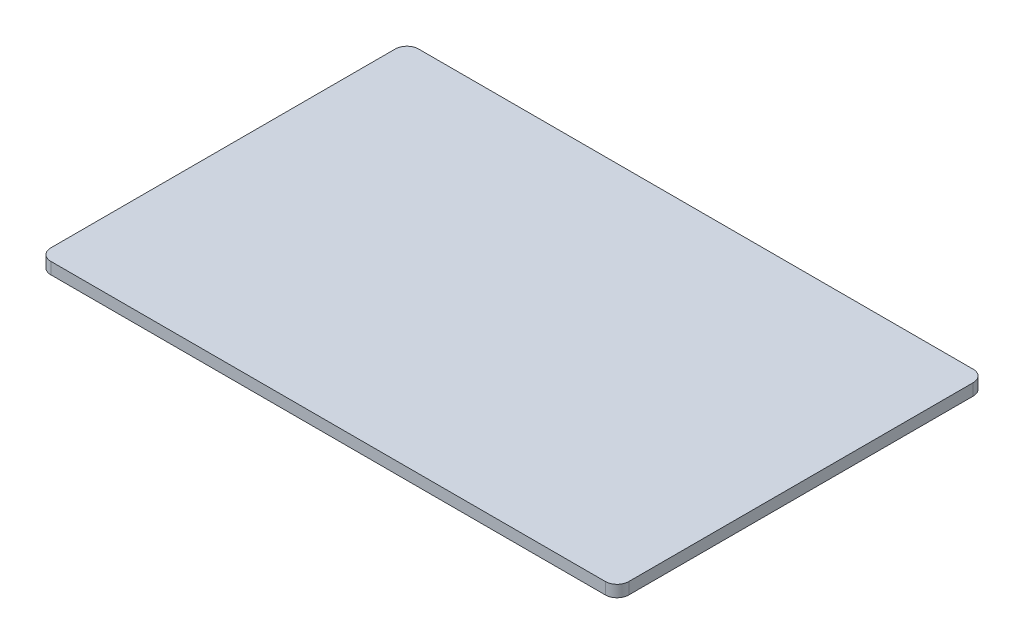
ISO-10303-21;
HEADER;
FILE_DESCRIPTION(('STEP AP214'),'2;1');
FILE_NAME('part.step','',(''),(''),'','','');
FILE_SCHEMA(('AUTOMOTIVE_DESIGN { 1 0 10303 214 1 1 1 1 }'));
ENDSEC;
DATA;
#1=APPLICATION_CONTEXT('core data for automotive mechanical design processes');
#2=APPLICATION_PROTOCOL_DEFINITION('international standard','automotive_design',2000,#1);
#3=PRODUCT_CONTEXT('',#1,'mechanical');
#4=PRODUCT('Part','Part','',(#3));
#5=PRODUCT_RELATED_PRODUCT_CATEGORY('part','',(#4));
#6=PRODUCT_DEFINITION_FORMATION('','',#4);
#7=PRODUCT_DEFINITION_CONTEXT('part definition',#1,'design');
#8=PRODUCT_DEFINITION('design','',#6,#7);
#9=PRODUCT_DEFINITION_SHAPE('','',#8);
#10=(LENGTH_UNIT() NAMED_UNIT(*) SI_UNIT(.MILLI.,.METRE.));
#11=(NAMED_UNIT(*) PLANE_ANGLE_UNIT() SI_UNIT($,.RADIAN.));
#12=(NAMED_UNIT(*) SI_UNIT($,.STERADIAN.) SOLID_ANGLE_UNIT());
#13=UNCERTAINTY_MEASURE_WITH_UNIT(LENGTH_MEASURE(1.E-05),#10,'distance_accuracy_value','');
#14=(GEOMETRIC_REPRESENTATION_CONTEXT(3) GLOBAL_UNCERTAINTY_ASSIGNED_CONTEXT((#13)) GLOBAL_UNIT_ASSIGNED_CONTEXT((#10,
#11,#12)) REPRESENTATION_CONTEXT('',''));
#15=CARTESIAN_POINT('',(0.,0.,0.));
#16=DIRECTION('',(0.,0.,1.));
#17=DIRECTION('',(1.,0.,0.));
#18=AXIS2_PLACEMENT_3D('',#15,#16,#17);
#19=CARTESIAN_POINT('',(-49.5,2.,-31.5));
#20=DIRECTION('',(1.,0.,0.));
#21=DIRECTION('',(0.,0.,-1.));
#22=AXIS2_PLACEMENT_3D('',#19,#20,#21);
#23=PLANE('',#22);
#24=DIRECTION('',(0.,0.,1.));
#25=VECTOR('',#24,1.);
#26=CARTESIAN_POINT('',(-49.5,2.,-31.5));
#27=LINE('',#26,#25);
#28=CARTESIAN_POINT('',(-49.5,2.,-29.5));
#29=VERTEX_POINT('',#28);
#30=CARTESIAN_POINT('',(-49.5,2.,29.5));
#31=VERTEX_POINT('',#30);
#32=EDGE_CURVE('E118',#29,#31,#27,.T.);
#33=ORIENTED_EDGE('',*,*,#32,.F.);
#34=DIRECTION('',(0.,-1.,0.));
#35=VECTOR('',#34,1.);
#36=CARTESIAN_POINT('',(-49.5,2.,-29.5));
#37=LINE('',#36,#35);
#38=CARTESIAN_POINT('',(-49.5,0.,-29.5));
#39=VERTEX_POINT('',#38);
#40=EDGE_CURVE('E103',#29,#39,#37,.T.);
#41=ORIENTED_EDGE('',*,*,#40,.T.);
#42=DIRECTION('',(0.,0.,1.));
#43=VECTOR('',#42,1.);
#44=CARTESIAN_POINT('',(-49.5,0.,-31.5));
#45=LINE('',#44,#43);
#46=CARTESIAN_POINT('',(-49.5,0.,29.5));
#47=VERTEX_POINT('',#46);
#48=EDGE_CURVE('E115',#39,#47,#45,.T.);
#49=ORIENTED_EDGE('',*,*,#48,.T.);
#50=DIRECTION('',(0.,-1.,0.));
#51=VECTOR('',#50,1.);
#52=CARTESIAN_POINT('',(-49.5,2.,29.5));
#53=LINE('',#52,#51);
#54=EDGE_CURVE('E120',#47,#31,#53,.F.);
#55=ORIENTED_EDGE('',*,*,#54,.T.);
#56=EDGE_LOOP('',(#33,#41,#49,#55));
#57=FACE_BOUND('',#56,.T.);
#58=ADVANCED_FACE('F33',(#57),#23,.F.);
#59=CARTESIAN_POINT('',(-49.5,2.,31.5));
#60=DIRECTION('',(0.,0.,-1.));
#61=DIRECTION('',(-1.,0.,0.));
#62=AXIS2_PLACEMENT_3D('',#59,#60,#61);
#63=PLANE('',#62);
#64=DIRECTION('',(1.,0.,0.));
#65=VECTOR('',#64,1.);
#66=CARTESIAN_POINT('',(-49.5,0.,31.5));
#67=LINE('',#66,#65);
#68=CARTESIAN_POINT('',(-47.5,0.,31.5));
#69=VERTEX_POINT('',#68);
#70=CARTESIAN_POINT('',(47.5,0.,31.5));
#71=VERTEX_POINT('',#70);
#72=EDGE_CURVE('E124',#69,#71,#67,.T.);
#73=ORIENTED_EDGE('',*,*,#72,.T.);
#74=DIRECTION('',(0.,-1.,0.));
#75=VECTOR('',#74,1.);
#76=CARTESIAN_POINT('',(47.5,2.,31.5));
#77=LINE('',#76,#75);
#78=CARTESIAN_POINT('',(47.5,2.,31.5));
#79=VERTEX_POINT('',#78);
#80=EDGE_CURVE('E11',#71,#79,#77,.F.);
#81=ORIENTED_EDGE('',*,*,#80,.T.);
#82=DIRECTION('',(1.,0.,0.));
#83=VECTOR('',#82,1.);
#84=CARTESIAN_POINT('',(-49.5,2.,31.5));
#85=LINE('',#84,#83);
#86=CARTESIAN_POINT('',(-47.5,2.,31.5));
#87=VERTEX_POINT('',#86);
#88=EDGE_CURVE('E160',#87,#79,#85,.T.);
#89=ORIENTED_EDGE('',*,*,#88,.F.);
#90=DIRECTION('',(0.,-1.,0.));
#91=VECTOR('',#90,1.);
#92=CARTESIAN_POINT('',(-47.5,2.,31.5));
#93=LINE('',#92,#91);
#94=EDGE_CURVE('E41',#87,#69,#93,.T.);
#95=ORIENTED_EDGE('',*,*,#94,.T.);
#96=EDGE_LOOP('',(#73,#81,#89,#95));
#97=FACE_BOUND('',#96,.T.);
#98=ADVANCED_FACE('F158',(#97),#63,.F.);
#99=CARTESIAN_POINT('',(49.5,2.,-31.5));
#100=DIRECTION('',(-1.,0.,0.));
#101=DIRECTION('',(0.,0.,1.));
#102=AXIS2_PLACEMENT_3D('',#99,#100,#101);
#103=PLANE('',#102);
#104=DIRECTION('',(0.,0.,-1.));
#105=VECTOR('',#104,1.);
#106=CARTESIAN_POINT('',(49.5,0.,-31.5));
#107=LINE('',#106,#105);
#108=CARTESIAN_POINT('',(49.5,0.,29.5));
#109=VERTEX_POINT('',#108);
#110=CARTESIAN_POINT('',(49.5,0.,-29.5));
#111=VERTEX_POINT('',#110);
#112=EDGE_CURVE('E127',#109,#111,#107,.T.);
#113=ORIENTED_EDGE('',*,*,#112,.T.);
#114=DIRECTION('',(0.,-1.,0.));
#115=VECTOR('',#114,1.);
#116=CARTESIAN_POINT('',(49.5,2.,-29.5));
#117=LINE('',#116,#115);
#118=CARTESIAN_POINT('',(49.5,2.,-29.5));
#119=VERTEX_POINT('',#118);
#120=EDGE_CURVE('E48',#111,#119,#117,.F.);
#121=ORIENTED_EDGE('',*,*,#120,.T.);
#122=DIRECTION('',(0.,0.,-1.));
#123=VECTOR('',#122,1.);
#124=CARTESIAN_POINT('',(49.5,2.,-31.5));
#125=LINE('',#124,#123);
#126=CARTESIAN_POINT('',(49.5,2.,29.5));
#127=VERTEX_POINT('',#126);
#128=EDGE_CURVE('E168',#127,#119,#125,.T.);
#129=ORIENTED_EDGE('',*,*,#128,.F.);
#130=DIRECTION('',(0.,-1.,0.));
#131=VECTOR('',#130,1.);
#132=CARTESIAN_POINT('',(49.5,2.,29.5));
#133=LINE('',#132,#131);
#134=EDGE_CURVE('E151',#127,#109,#133,.T.);
#135=ORIENTED_EDGE('',*,*,#134,.T.);
#136=EDGE_LOOP('',(#113,#121,#129,#135));
#137=FACE_BOUND('',#136,.T.);
#138=ADVANCED_FACE('F167',(#137),#103,.F.);
#139=CARTESIAN_POINT('',(-49.5,2.,-31.5));
#140=DIRECTION('',(0.,0.,1.));
#141=DIRECTION('',(1.,0.,0.));
#142=AXIS2_PLACEMENT_3D('',#139,#140,#141);
#143=PLANE('',#142);
#144=DIRECTION('',(-1.,0.,0.));
#145=VECTOR('',#144,1.);
#146=CARTESIAN_POINT('',(-49.5,0.,-31.5));
#147=LINE('',#146,#145);
#148=CARTESIAN_POINT('',(47.5,0.,-31.5));
#149=VERTEX_POINT('',#148);
#150=CARTESIAN_POINT('',(-47.5,0.,-31.5));
#151=VERTEX_POINT('',#150);
#152=EDGE_CURVE('E134',#149,#151,#147,.T.);
#153=ORIENTED_EDGE('',*,*,#152,.T.);
#154=DIRECTION('',(0.,-1.,0.));
#155=VECTOR('',#154,1.);
#156=CARTESIAN_POINT('',(-47.5,2.,-31.5));
#157=LINE('',#156,#155);
#158=CARTESIAN_POINT('',(-47.5,2.,-31.5));
#159=VERTEX_POINT('',#158);
#160=EDGE_CURVE('E104',#151,#159,#157,.F.);
#161=ORIENTED_EDGE('',*,*,#160,.T.);
#162=DIRECTION('',(-1.,0.,0.));
#163=VECTOR('',#162,1.);
#164=CARTESIAN_POINT('',(-49.5,2.,-31.5));
#165=LINE('',#164,#163);
#166=CARTESIAN_POINT('',(47.5,2.,-31.5));
#167=VERTEX_POINT('',#166);
#168=EDGE_CURVE('E130',#167,#159,#165,.T.);
#169=ORIENTED_EDGE('',*,*,#168,.F.);
#170=DIRECTION('',(0.,-1.,0.));
#171=VECTOR('',#170,1.);
#172=CARTESIAN_POINT('',(47.5,2.,-31.5));
#173=LINE('',#172,#171);
#174=EDGE_CURVE('E109',#167,#149,#173,.T.);
#175=ORIENTED_EDGE('',*,*,#174,.T.);
#176=EDGE_LOOP('',(#153,#161,#169,#175));
#177=FACE_BOUND('',#176,.T.);
#178=ADVANCED_FACE('F196',(#177),#143,.F.);
#179=CARTESIAN_POINT('',(0.,2.,0.));
#180=DIRECTION('',(0.,1.,0.));
#181=DIRECTION('',(0.,0.,1.));
#182=AXIS2_PLACEMENT_3D('',#179,#180,#181);
#183=PLANE('',#182);
#184=ORIENTED_EDGE('',*,*,#168,.T.);
#185=CARTESIAN_POINT('',(-47.5,2.,-29.5));
#186=DIRECTION('',(0.,1.,0.));
#187=DIRECTION('',(0.,0.,1.));
#188=AXIS2_PLACEMENT_3D('',#185,#186,#187);
#189=CIRCLE('',#188,2.);
#190=EDGE_CURVE('E149',#159,#29,#189,.T.);
#191=ORIENTED_EDGE('',*,*,#190,.T.);
#192=ORIENTED_EDGE('',*,*,#32,.T.);
#193=CARTESIAN_POINT('',(-47.5,2.,29.5));
#194=DIRECTION('',(0.,1.,0.));
#195=DIRECTION('',(0.,0.,1.));
#196=AXIS2_PLACEMENT_3D('',#193,#194,#195);
#197=CIRCLE('',#196,2.);
#198=EDGE_CURVE('E144',#31,#87,#197,.T.);
#199=ORIENTED_EDGE('',*,*,#198,.T.);
#200=ORIENTED_EDGE('',*,*,#88,.T.);
#201=CARTESIAN_POINT('',(47.5,2.,29.5));
#202=DIRECTION('',(0.,1.,0.));
#203=DIRECTION('',(0.,0.,1.));
#204=AXIS2_PLACEMENT_3D('',#201,#202,#203);
#205=CIRCLE('',#204,2.);
#206=EDGE_CURVE('E55',#79,#127,#205,.T.);
#207=ORIENTED_EDGE('',*,*,#206,.T.);
#208=ORIENTED_EDGE('',*,*,#128,.T.);
#209=CARTESIAN_POINT('',(47.5,2.,-29.5));
#210=DIRECTION('',(0.,1.,0.));
#211=DIRECTION('',(0.,0.,1.));
#212=AXIS2_PLACEMENT_3D('',#209,#210,#211);
#213=CIRCLE('',#212,2.);
#214=EDGE_CURVE('E147',#119,#167,#213,.T.);
#215=ORIENTED_EDGE('',*,*,#214,.T.);
#216=EDGE_LOOP('',(#184,#191,#192,#199,#200,#207,#208,#215));
#217=FACE_BOUND('',#216,.T.);
#218=ADVANCED_FACE('F173',(#217),#183,.T.);
#219=CARTESIAN_POINT('',(0.,0.,0.));
#220=DIRECTION('',(0.,1.,0.));
#221=DIRECTION('',(0.,0.,1.));
#222=AXIS2_PLACEMENT_3D('',#219,#220,#221);
#223=PLANE('',#222);
#224=ORIENTED_EDGE('',*,*,#48,.F.);
#225=CARTESIAN_POINT('',(-47.5,0.,-29.5));
#226=DIRECTION('',(0.,1.,0.));
#227=DIRECTION('',(0.,0.,1.));
#228=AXIS2_PLACEMENT_3D('',#225,#226,#227);
#229=CIRCLE('',#228,2.);
#230=EDGE_CURVE('E99',#39,#151,#229,.F.);
#231=ORIENTED_EDGE('',*,*,#230,.T.);
#232=ORIENTED_EDGE('',*,*,#152,.F.);
#233=CARTESIAN_POINT('',(47.5,0.,-29.5));
#234=DIRECTION('',(0.,1.,0.));
#235=DIRECTION('',(0.,0.,1.));
#236=AXIS2_PLACEMENT_3D('',#233,#234,#235);
#237=CIRCLE('',#236,2.);
#238=EDGE_CURVE('E110',#149,#111,#237,.F.);
#239=ORIENTED_EDGE('',*,*,#238,.T.);
#240=ORIENTED_EDGE('',*,*,#112,.F.);
#241=CARTESIAN_POINT('',(47.5,0.,29.5));
#242=DIRECTION('',(0.,1.,0.));
#243=DIRECTION('',(0.,0.,1.));
#244=AXIS2_PLACEMENT_3D('',#241,#242,#243);
#245=CIRCLE('',#244,2.);
#246=EDGE_CURVE('E138',#109,#71,#245,.F.);
#247=ORIENTED_EDGE('',*,*,#246,.T.);
#248=ORIENTED_EDGE('',*,*,#72,.F.);
#249=CARTESIAN_POINT('',(-47.5,0.,29.5));
#250=DIRECTION('',(0.,1.,0.));
#251=DIRECTION('',(0.,0.,1.));
#252=AXIS2_PLACEMENT_3D('',#249,#250,#251);
#253=CIRCLE('',#252,2.);
#254=EDGE_CURVE('E119',#69,#47,#253,.F.);
#255=ORIENTED_EDGE('',*,*,#254,.T.);
#256=EDGE_LOOP('',(#224,#231,#232,#239,#240,#247,#248,#255));
#257=FACE_BOUND('',#256,.T.);
#258=ADVANCED_FACE('F122',(#257),#223,.F.);
#259=CARTESIAN_POINT('',(-47.5,2.,-29.5));
#260=DIRECTION('',(0.,-1.,0.));
#261=DIRECTION('',(0.,0.,-1.));
#262=AXIS2_PLACEMENT_3D('',#259,#260,#261);
#263=CYLINDRICAL_SURFACE('',#262,2.);
#264=ORIENTED_EDGE('',*,*,#190,.F.);
#265=ORIENTED_EDGE('',*,*,#160,.F.);
#266=ORIENTED_EDGE('',*,*,#230,.F.);
#267=ORIENTED_EDGE('',*,*,#40,.F.);
#268=EDGE_LOOP('',(#264,#265,#266,#267));
#269=FACE_BOUND('',#268,.T.);
#270=ADVANCED_FACE('F102',(#269),#263,.T.);
#271=CARTESIAN_POINT('',(47.5,2.,-29.5));
#272=DIRECTION('',(0.,-1.,0.));
#273=DIRECTION('',(0.,0.,-1.));
#274=AXIS2_PLACEMENT_3D('',#271,#272,#273);
#275=CYLINDRICAL_SURFACE('',#274,2.);
#276=ORIENTED_EDGE('',*,*,#214,.F.);
#277=ORIENTED_EDGE('',*,*,#120,.F.);
#278=ORIENTED_EDGE('',*,*,#238,.F.);
#279=ORIENTED_EDGE('',*,*,#174,.F.);
#280=EDGE_LOOP('',(#276,#277,#278,#279));
#281=FACE_BOUND('',#280,.T.);
#282=ADVANCED_FACE('F178',(#281),#275,.T.);
#283=CARTESIAN_POINT('',(47.5,2.,29.5));
#284=DIRECTION('',(0.,-1.,0.));
#285=DIRECTION('',(0.,0.,-1.));
#286=AXIS2_PLACEMENT_3D('',#283,#284,#285);
#287=CYLINDRICAL_SURFACE('',#286,2.);
#288=ORIENTED_EDGE('',*,*,#206,.F.);
#289=ORIENTED_EDGE('',*,*,#80,.F.);
#290=ORIENTED_EDGE('',*,*,#246,.F.);
#291=ORIENTED_EDGE('',*,*,#134,.F.);
#292=EDGE_LOOP('',(#288,#289,#290,#291));
#293=FACE_BOUND('',#292,.T.);
#294=ADVANCED_FACE('F166',(#293),#287,.T.);
#295=CARTESIAN_POINT('',(-47.5,2.,29.5));
#296=DIRECTION('',(0.,-1.,0.));
#297=DIRECTION('',(0.,0.,-1.));
#298=AXIS2_PLACEMENT_3D('',#295,#296,#297);
#299=CYLINDRICAL_SURFACE('',#298,2.);
#300=ORIENTED_EDGE('',*,*,#198,.F.);
#301=ORIENTED_EDGE('',*,*,#54,.F.);
#302=ORIENTED_EDGE('',*,*,#254,.F.);
#303=ORIENTED_EDGE('',*,*,#94,.F.);
#304=EDGE_LOOP('',(#300,#301,#302,#303));
#305=FACE_BOUND('',#304,.T.);
#306=ADVANCED_FACE('F35',(#305),#299,.T.);
#307=CLOSED_SHELL('',(#58,#98,#138,#178,#218,#258,#270,#282,#294,#306));
#308=MANIFOLD_SOLID_BREP('B2',#307);
#309=ADVANCED_BREP_SHAPE_REPRESENTATION('',(#18,#308),#14);
#310=SHAPE_DEFINITION_REPRESENTATION(#9,#309);
ENDSEC;
END-ISO-10303-21;
